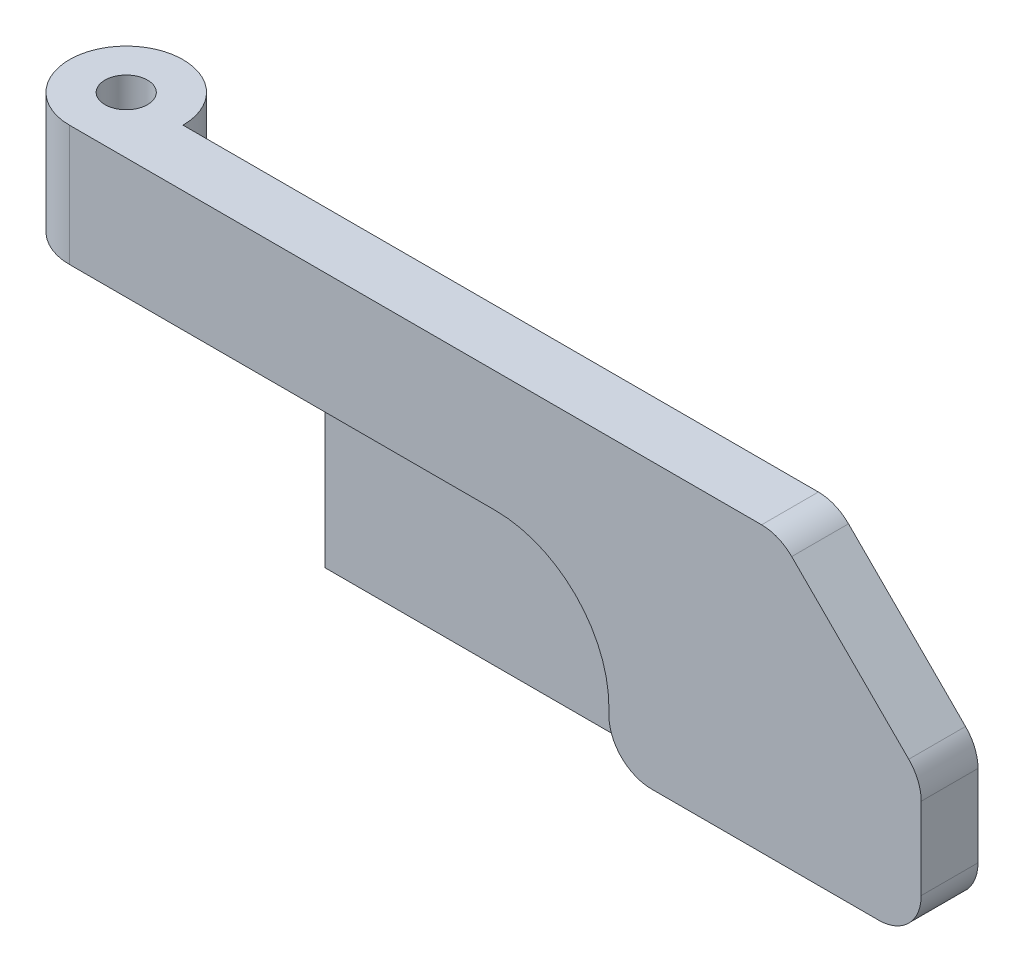
ISO-10303-21;
HEADER;
FILE_DESCRIPTION(('STEP AP214'),'2;1');
FILE_NAME('part.step','',(''),(''),'','','');
FILE_SCHEMA(('AUTOMOTIVE_DESIGN { 1 0 10303 214 1 1 1 1 }'));
ENDSEC;
DATA;
#1=APPLICATION_CONTEXT('core data for automotive mechanical design processes');
#2=APPLICATION_PROTOCOL_DEFINITION('international standard','automotive_design',2000,#1);
#3=PRODUCT_CONTEXT('',#1,'mechanical');
#4=PRODUCT('Part','Part','',(#3));
#5=PRODUCT_RELATED_PRODUCT_CATEGORY('part','',(#4));
#6=PRODUCT_DEFINITION_FORMATION('','',#4);
#7=PRODUCT_DEFINITION_CONTEXT('part definition',#1,'design');
#8=PRODUCT_DEFINITION('design','',#6,#7);
#9=PRODUCT_DEFINITION_SHAPE('','',#8);
#10=(LENGTH_UNIT() NAMED_UNIT(*) SI_UNIT(.MILLI.,.METRE.));
#11=(NAMED_UNIT(*) PLANE_ANGLE_UNIT() SI_UNIT($,.RADIAN.));
#12=(NAMED_UNIT(*) SI_UNIT($,.STERADIAN.) SOLID_ANGLE_UNIT());
#13=UNCERTAINTY_MEASURE_WITH_UNIT(LENGTH_MEASURE(1.E-05),#10,'distance_accuracy_value','');
#14=(GEOMETRIC_REPRESENTATION_CONTEXT(3) GLOBAL_UNCERTAINTY_ASSIGNED_CONTEXT((#13)) GLOBAL_UNIT_ASSIGNED_CONTEXT((#10,
#11,#12)) REPRESENTATION_CONTEXT('',''));
#15=CARTESIAN_POINT('',(0.,0.,0.));
#16=DIRECTION('',(0.,0.,1.));
#17=DIRECTION('',(1.,0.,0.));
#18=AXIS2_PLACEMENT_3D('',#15,#16,#17);
#19=CARTESIAN_POINT('',(0.,20.,0.));
#20=DIRECTION('',(0.,-1.,0.));
#21=DIRECTION('',(0.,0.,-1.));
#22=AXIS2_PLACEMENT_3D('',#19,#20,#21);
#23=CYLINDRICAL_SURFACE('',#22,4.);
#24=DIRECTION('',(0.,-1.,0.));
#25=VECTOR('',#24,1.);
#26=CARTESIAN_POINT('',(4.,20.,0.));
#27=LINE('',#26,#25);
#28=CARTESIAN_POINT('',(4.,20.,0.));
#29=VERTEX_POINT('',#28);
#30=CARTESIAN_POINT('',(4.,11.5,0.));
#31=VERTEX_POINT('',#30);
#32=EDGE_CURVE('E278',#29,#31,#27,.T.);
#33=ORIENTED_EDGE('',*,*,#32,.T.);
#34=CARTESIAN_POINT('',(0.,11.5,0.));
#35=DIRECTION('',(0.,1.,0.));
#36=DIRECTION('',(0.,0.,1.));
#37=AXIS2_PLACEMENT_3D('',#34,#35,#36);
#38=CIRCLE('',#37,4.);
#39=CARTESIAN_POINT('',(0.,11.5,4.));
#40=VERTEX_POINT('',#39);
#41=EDGE_CURVE('E300',#31,#40,#38,.T.);
#42=ORIENTED_EDGE('',*,*,#41,.T.);
#43=DIRECTION('',(0.,-1.,0.));
#44=VECTOR('',#43,1.);
#45=CARTESIAN_POINT('',(0.,20.,4.));
#46=LINE('',#45,#44);
#47=CARTESIAN_POINT('',(0.,20.,4.));
#48=VERTEX_POINT('',#47);
#49=EDGE_CURVE('E165',#48,#40,#46,.T.);
#50=ORIENTED_EDGE('',*,*,#49,.F.);
#51=CARTESIAN_POINT('',(0.,20.,0.));
#52=DIRECTION('',(0.,1.,0.));
#53=DIRECTION('',(0.,0.,1.));
#54=AXIS2_PLACEMENT_3D('',#51,#52,#53);
#55=CIRCLE('',#54,4.);
#56=EDGE_CURVE('E293',#29,#48,#55,.T.);
#57=ORIENTED_EDGE('',*,*,#56,.F.);
#58=EDGE_LOOP('',(#33,#42,#50,#57));
#59=FACE_BOUND('',#58,.T.);
#60=ADVANCED_FACE('F35',(#59),#23,.T.);
#61=CARTESIAN_POINT('',(0.,20.,4.));
#62=DIRECTION('',(0.,0.,-1.));
#63=DIRECTION('',(-1.,0.,0.));
#64=AXIS2_PLACEMENT_3D('',#61,#62,#63);
#65=PLANE('',#64);
#66=DIRECTION('',(0.,1.,0.));
#67=VECTOR('',#66,1.);
#68=CARTESIAN_POINT('',(38.,11.5,4.));
#69=LINE('',#68,#67);
#70=CARTESIAN_POINT('',(38.,3.,4.));
#71=VERTEX_POINT('',#70);
#72=CARTESIAN_POINT('',(38.,3.5,4.));
#73=VERTEX_POINT('',#72);
#74=EDGE_CURVE('E158',#71,#73,#69,.T.);
#75=ORIENTED_EDGE('',*,*,#74,.F.);
#76=CARTESIAN_POINT('',(41.,3.,4.));
#77=DIRECTION('',(0.,0.,-1.));
#78=DIRECTION('',(-1.,0.,0.));
#79=AXIS2_PLACEMENT_3D('',#76,#77,#78);
#80=CIRCLE('',#79,3.);
#81=CARTESIAN_POINT('',(41.,0.,4.));
#82=VERTEX_POINT('',#81);
#83=EDGE_CURVE('E211',#71,#82,#80,.F.);
#84=ORIENTED_EDGE('',*,*,#83,.T.);
#85=DIRECTION('',(1.,0.,0.));
#86=VECTOR('',#85,1.);
#87=CARTESIAN_POINT('',(0.,0.,4.));
#88=LINE('',#87,#86);
#89=CARTESIAN_POINT('',(57.,0.,4.));
#90=VERTEX_POINT('',#89);
#91=EDGE_CURVE('E286',#82,#90,#88,.T.);
#92=ORIENTED_EDGE('',*,*,#91,.T.);
#93=CARTESIAN_POINT('',(57.,3.,4.));
#94=DIRECTION('',(0.,0.,-1.));
#95=DIRECTION('',(-1.,0.,0.));
#96=AXIS2_PLACEMENT_3D('',#93,#94,#95);
#97=CIRCLE('',#96,3.);
#98=CARTESIAN_POINT('',(60.,3.,4.));
#99=VERTEX_POINT('',#98);
#100=EDGE_CURVE('E187',#90,#99,#97,.F.);
#101=ORIENTED_EDGE('',*,*,#100,.T.);
#102=DIRECTION('',(0.,-1.,0.));
#103=VECTOR('',#102,1.);
#104=CARTESIAN_POINT('',(60.,20.,4.));
#105=LINE('',#104,#103);
#106=CARTESIAN_POINT('',(60.,8.75735931288068,4.));
#107=VERTEX_POINT('',#106);
#108=EDGE_CURVE('E170',#107,#99,#105,.T.);
#109=ORIENTED_EDGE('',*,*,#108,.F.);
#110=CARTESIAN_POINT('',(57.,8.75735931288068,4.));
#111=DIRECTION('',(0.,0.,-1.));
#112=DIRECTION('',(-1.,0.,0.));
#113=AXIS2_PLACEMENT_3D('',#110,#111,#112);
#114=CIRCLE('',#113,3.);
#115=CARTESIAN_POINT('',(59.1213203435596,10.8786796564403,4.));
#116=VERTEX_POINT('',#115);
#117=EDGE_CURVE('E201',#107,#116,#114,.F.);
#118=ORIENTED_EDGE('',*,*,#117,.T.);
#119=DIRECTION('',(-0.707106781186546,0.707106781186549,0.));
#120=VECTOR('',#119,1.);
#121=CARTESIAN_POINT('',(50.,20.,4.));
#122=LINE('',#121,#120);
#123=CARTESIAN_POINT('',(50.8786796564404,19.1213203435596,4.));
#124=VERTEX_POINT('',#123);
#125=EDGE_CURVE('E176',#116,#124,#122,.T.);
#126=ORIENTED_EDGE('',*,*,#125,.T.);
#127=CARTESIAN_POINT('',(48.7573593128807,17.,4.));
#128=DIRECTION('',(0.,0.,-1.));
#129=DIRECTION('',(-1.,0.,0.));
#130=AXIS2_PLACEMENT_3D('',#127,#128,#129);
#131=CIRCLE('',#130,3.);
#132=CARTESIAN_POINT('',(48.7573593128807,20.,4.));
#133=VERTEX_POINT('',#132);
#134=EDGE_CURVE('E203',#124,#133,#131,.F.);
#135=ORIENTED_EDGE('',*,*,#134,.T.);
#136=DIRECTION('',(1.,0.,0.));
#137=VECTOR('',#136,1.);
#138=CARTESIAN_POINT('',(0.,20.,4.));
#139=LINE('',#138,#137);
#140=EDGE_CURVE('E290',#48,#133,#139,.T.);
#141=ORIENTED_EDGE('',*,*,#140,.F.);
#142=ORIENTED_EDGE('',*,*,#49,.T.);
#143=DIRECTION('',(-1.,0.,0.));
#144=VECTOR('',#143,1.);
#145=CARTESIAN_POINT('',(-11.8071770657587,11.5,4.));
#146=LINE('',#145,#144);
#147=CARTESIAN_POINT('',(30.,11.5,4.));
#148=VERTEX_POINT('',#147);
#149=EDGE_CURVE('E146',#148,#40,#146,.T.);
#150=ORIENTED_EDGE('',*,*,#149,.F.);
#151=CARTESIAN_POINT('',(30.,3.5,4.));
#152=DIRECTION('',(0.,0.,-1.));
#153=DIRECTION('',(-1.,0.,0.));
#154=AXIS2_PLACEMENT_3D('',#151,#152,#153);
#155=CIRCLE('',#154,8.);
#156=EDGE_CURVE('E11',#148,#73,#155,.T.);
#157=ORIENTED_EDGE('',*,*,#156,.T.);
#158=EDGE_LOOP('',(#75,#84,#92,#101,#109,#118,#126,#135,#141,#142,#150,#157));
#159=FACE_BOUND('',#158,.T.);
#160=ADVANCED_FACE('F234',(#159),#65,.F.);
#161=CARTESIAN_POINT('',(60.,20.,0.));
#162=DIRECTION('',(-1.,0.,0.));
#163=DIRECTION('',(0.,0.,1.));
#164=AXIS2_PLACEMENT_3D('',#161,#162,#163);
#165=PLANE('',#164);
#166=DIRECTION('',(0.,-1.,0.));
#167=VECTOR('',#166,1.);
#168=CARTESIAN_POINT('',(60.,20.,0.));
#169=LINE('',#168,#167);
#170=CARTESIAN_POINT('',(60.,8.75735931288068,0.));
#171=VERTEX_POINT('',#170);
#172=CARTESIAN_POINT('',(60.,3.,0.));
#173=VERTEX_POINT('',#172);
#174=EDGE_CURVE('E272',#171,#173,#169,.T.);
#175=ORIENTED_EDGE('',*,*,#174,.F.);
#176=DIRECTION('',(0.,0.,1.));
#177=VECTOR('',#176,1.);
#178=CARTESIAN_POINT('',(60.,8.75735931288068,4.));
#179=LINE('',#178,#177);
#180=EDGE_CURVE('E205',#171,#107,#179,.T.);
#181=ORIENTED_EDGE('',*,*,#180,.T.);
#182=ORIENTED_EDGE('',*,*,#108,.T.);
#183=DIRECTION('',(0.,0.,-1.));
#184=VECTOR('',#183,1.);
#185=CARTESIAN_POINT('',(60.,3.,0.));
#186=LINE('',#185,#184);
#187=EDGE_CURVE('E179',#99,#173,#186,.T.);
#188=ORIENTED_EDGE('',*,*,#187,.T.);
#189=EDGE_LOOP('',(#175,#181,#182,#188));
#190=FACE_BOUND('',#189,.T.);
#191=ADVANCED_FACE('F240',(#190),#165,.F.);
#192=CARTESIAN_POINT('',(0.,20.,0.));
#193=DIRECTION('',(0.,-1.,0.));
#194=DIRECTION('',(0.,0.,-1.));
#195=AXIS2_PLACEMENT_3D('',#192,#193,#194);
#196=CYLINDRICAL_SURFACE('',#195,1.5);
#197=CARTESIAN_POINT('',(0.,11.5,0.));
#198=DIRECTION('',(0.,1.,0.));
#199=DIRECTION('',(0.,0.,1.));
#200=AXIS2_PLACEMENT_3D('',#197,#198,#199);
#201=CIRCLE('',#200,1.5);
#202=CARTESIAN_POINT('',(0.,11.5,1.5));
#203=VERTEX_POINT('',#202);
#204=EDGE_CURVE('E288',#203,#203,#201,.T.);
#205=ORIENTED_EDGE('',*,*,#204,.F.);
#206=EDGE_LOOP('',(#205));
#207=FACE_BOUND('',#206,.T.);
#208=CARTESIAN_POINT('',(0.,20.,0.));
#209=DIRECTION('',(0.,1.,0.));
#210=DIRECTION('',(0.,0.,1.));
#211=AXIS2_PLACEMENT_3D('',#208,#209,#210);
#212=CIRCLE('',#211,1.5);
#213=CARTESIAN_POINT('',(0.,20.,1.5));
#214=VERTEX_POINT('',#213);
#215=EDGE_CURVE('E285',#214,#214,#212,.T.);
#216=ORIENTED_EDGE('',*,*,#215,.T.);
#217=EDGE_LOOP('',(#216));
#218=FACE_BOUND('',#217,.T.);
#219=ADVANCED_FACE('F245',(#207,#218),#196,.F.);
#220=CARTESIAN_POINT('',(0.,20.,0.));
#221=DIRECTION('',(0.,0.,-1.));
#222=DIRECTION('',(-1.,0.,0.));
#223=AXIS2_PLACEMENT_3D('',#220,#221,#222);
#224=PLANE('',#223);
#225=DIRECTION('',(1.,0.,0.));
#226=VECTOR('',#225,1.);
#227=CARTESIAN_POINT('',(0.,20.,0.));
#228=LINE('',#227,#226);
#229=CARTESIAN_POINT('',(48.7573593128807,20.,0.));
#230=VERTEX_POINT('',#229);
#231=EDGE_CURVE('E280',#29,#230,#228,.T.);
#232=ORIENTED_EDGE('',*,*,#231,.T.);
#233=CARTESIAN_POINT('',(48.7573593128807,17.,0.));
#234=DIRECTION('',(0.,0.,-1.));
#235=DIRECTION('',(-1.,0.,0.));
#236=AXIS2_PLACEMENT_3D('',#233,#234,#235);
#237=CIRCLE('',#236,3.);
#238=CARTESIAN_POINT('',(50.8786796564404,19.1213203435596,0.));
#239=VERTEX_POINT('',#238);
#240=EDGE_CURVE('E195',#230,#239,#237,.T.);
#241=ORIENTED_EDGE('',*,*,#240,.T.);
#242=DIRECTION('',(0.707106781186546,-0.707106781186549,0.));
#243=VECTOR('',#242,1.);
#244=CARTESIAN_POINT('',(25.0000000000001,45.,0.));
#245=LINE('',#244,#243);
#246=CARTESIAN_POINT('',(59.1213203435596,10.8786796564403,0.));
#247=VERTEX_POINT('',#246);
#248=EDGE_CURVE('E167',#239,#247,#245,.T.);
#249=ORIENTED_EDGE('',*,*,#248,.T.);
#250=CARTESIAN_POINT('',(57.,8.75735931288068,0.));
#251=DIRECTION('',(0.,0.,-1.));
#252=DIRECTION('',(-1.,0.,0.));
#253=AXIS2_PLACEMENT_3D('',#250,#251,#252);
#254=CIRCLE('',#253,3.);
#255=EDGE_CURVE('E193',#247,#171,#254,.T.);
#256=ORIENTED_EDGE('',*,*,#255,.T.);
#257=ORIENTED_EDGE('',*,*,#174,.T.);
#258=CARTESIAN_POINT('',(57.,3.,0.));
#259=DIRECTION('',(0.,0.,-1.));
#260=DIRECTION('',(-1.,0.,0.));
#261=AXIS2_PLACEMENT_3D('',#258,#259,#260);
#262=CIRCLE('',#261,3.);
#263=CARTESIAN_POINT('',(57.,0.,0.));
#264=VERTEX_POINT('',#263);
#265=EDGE_CURVE('E182',#173,#264,#262,.T.);
#266=ORIENTED_EDGE('',*,*,#265,.T.);
#267=DIRECTION('',(1.,0.,0.));
#268=VECTOR('',#267,1.);
#269=CARTESIAN_POINT('',(0.,0.,0.));
#270=LINE('',#269,#268);
#271=CARTESIAN_POINT('',(16.,0.,0.));
#272=VERTEX_POINT('',#271);
#273=EDGE_CURVE('E283',#272,#264,#270,.T.);
#274=ORIENTED_EDGE('',*,*,#273,.F.);
#275=DIRECTION('',(0.,-1.,0.));
#276=VECTOR('',#275,1.);
#277=CARTESIAN_POINT('',(16.,20.,0.));
#278=LINE('',#277,#276);
#279=CARTESIAN_POINT('',(16.,11.5,0.));
#280=VERTEX_POINT('',#279);
#281=EDGE_CURVE('E162',#280,#272,#278,.T.);
#282=ORIENTED_EDGE('',*,*,#281,.F.);
#283=DIRECTION('',(1.,0.,0.));
#284=VECTOR('',#283,1.);
#285=CARTESIAN_POINT('',(0.,11.5,0.));
#286=LINE('',#285,#284);
#287=EDGE_CURVE('E164',#31,#280,#286,.T.);
#288=ORIENTED_EDGE('',*,*,#287,.F.);
#289=ORIENTED_EDGE('',*,*,#32,.F.);
#290=EDGE_LOOP('',(#232,#241,#249,#256,#257,#266,#274,#282,#288,#289));
#291=FACE_BOUND('',#290,.T.);
#292=ADVANCED_FACE('F248',(#291),#224,.T.);
#293=CARTESIAN_POINT('',(0.,20.,0.));
#294=DIRECTION('',(0.,1.,0.));
#295=DIRECTION('',(0.,0.,1.));
#296=AXIS2_PLACEMENT_3D('',#293,#294,#295);
#297=PLANE('',#296);
#298=ORIENTED_EDGE('',*,*,#215,.F.);
#299=EDGE_LOOP('',(#298));
#300=FACE_BOUND('',#299,.T.);
#301=ORIENTED_EDGE('',*,*,#140,.T.);
#302=DIRECTION('',(0.,0.,-1.));
#303=VECTOR('',#302,1.);
#304=CARTESIAN_POINT('',(48.7573593128807,20.,0.));
#305=LINE('',#304,#303);
#306=EDGE_CURVE('E190',#133,#230,#305,.T.);
#307=ORIENTED_EDGE('',*,*,#306,.T.);
#308=ORIENTED_EDGE('',*,*,#231,.F.);
#309=ORIENTED_EDGE('',*,*,#56,.T.);
#310=EDGE_LOOP('',(#301,#307,#308,#309));
#311=FACE_BOUND('',#310,.T.);
#312=ADVANCED_FACE('F316',(#300,#311),#297,.T.);
#313=CARTESIAN_POINT('',(0.,0.,0.));
#314=DIRECTION('',(0.,1.,0.));
#315=DIRECTION('',(0.,0.,1.));
#316=AXIS2_PLACEMENT_3D('',#313,#314,#315);
#317=PLANE('',#316);
#318=ORIENTED_EDGE('',*,*,#91,.F.);
#319=DIRECTION('',(0.,0.,1.));
#320=VECTOR('',#319,1.);
#321=CARTESIAN_POINT('',(41.,0.,0.));
#322=LINE('',#321,#320);
#323=CARTESIAN_POINT('',(41.,0.,2.));
#324=VERTEX_POINT('',#323);
#325=EDGE_CURVE('E155',#82,#324,#322,.F.);
#326=ORIENTED_EDGE('',*,*,#325,.T.);
#327=DIRECTION('',(1.,0.,0.));
#328=VECTOR('',#327,1.);
#329=CARTESIAN_POINT('',(38.,0.,2.));
#330=LINE('',#329,#328);
#331=CARTESIAN_POINT('',(16.,0.,2.));
#332=VERTEX_POINT('',#331);
#333=EDGE_CURVE('E138',#332,#324,#330,.T.);
#334=ORIENTED_EDGE('',*,*,#333,.F.);
#335=DIRECTION('',(0.,0.,-1.));
#336=VECTOR('',#335,1.);
#337=CARTESIAN_POINT('',(16.,0.,0.));
#338=LINE('',#337,#336);
#339=EDGE_CURVE('E152',#332,#272,#338,.T.);
#340=ORIENTED_EDGE('',*,*,#339,.T.);
#341=ORIENTED_EDGE('',*,*,#273,.T.);
#342=DIRECTION('',(0.,0.,-1.));
#343=VECTOR('',#342,1.);
#344=CARTESIAN_POINT('',(57.,0.,0.));
#345=LINE('',#344,#343);
#346=EDGE_CURVE('E184',#264,#90,#345,.F.);
#347=ORIENTED_EDGE('',*,*,#346,.T.);
#348=EDGE_LOOP('',(#318,#326,#334,#340,#341,#347));
#349=FACE_BOUND('',#348,.T.);
#350=ADVANCED_FACE('F150',(#349),#317,.F.);
#351=CARTESIAN_POINT('',(-11.8071770657587,11.5,-16.));
#352=DIRECTION('',(0.,1.,0.));
#353=DIRECTION('',(0.,0.,1.));
#354=AXIS2_PLACEMENT_3D('',#351,#352,#353);
#355=PLANE('',#354);
#356=ORIENTED_EDGE('',*,*,#204,.T.);
#357=EDGE_LOOP('',(#356));
#358=FACE_BOUND('',#357,.T.);
#359=DIRECTION('',(-1.,0.,0.));
#360=VECTOR('',#359,1.);
#361=CARTESIAN_POINT('',(16.,11.5,2.));
#362=LINE('',#361,#360);
#363=CARTESIAN_POINT('',(30.,11.5,2.));
#364=VERTEX_POINT('',#363);
#365=CARTESIAN_POINT('',(16.,11.5,2.));
#366=VERTEX_POINT('',#365);
#367=EDGE_CURVE('E141',#364,#366,#362,.T.);
#368=ORIENTED_EDGE('',*,*,#367,.F.);
#369=DIRECTION('',(0.,0.,1.));
#370=VECTOR('',#369,1.);
#371=CARTESIAN_POINT('',(30.,11.5,4.));
#372=LINE('',#371,#370);
#373=EDGE_CURVE('E216',#364,#148,#372,.T.);
#374=ORIENTED_EDGE('',*,*,#373,.T.);
#375=ORIENTED_EDGE('',*,*,#149,.T.);
#376=ORIENTED_EDGE('',*,*,#41,.F.);
#377=ORIENTED_EDGE('',*,*,#287,.T.);
#378=DIRECTION('',(0.,0.,1.));
#379=VECTOR('',#378,1.);
#380=CARTESIAN_POINT('',(16.,11.5,-16.));
#381=LINE('',#380,#379);
#382=EDGE_CURVE('E224',#280,#366,#381,.T.);
#383=ORIENTED_EDGE('',*,*,#382,.T.);
#384=EDGE_LOOP('',(#368,#374,#375,#376,#377,#383));
#385=FACE_BOUND('',#384,.T.);
#386=ADVANCED_FACE('F223',(#358,#385),#355,.F.);
#387=CARTESIAN_POINT('',(16.,11.5,-16.));
#388=DIRECTION('',(1.,0.,0.));
#389=DIRECTION('',(0.,0.,-1.));
#390=AXIS2_PLACEMENT_3D('',#387,#388,#389);
#391=PLANE('',#390);
#392=ORIENTED_EDGE('',*,*,#339,.F.);
#393=DIRECTION('',(0.,-1.,0.));
#394=VECTOR('',#393,1.);
#395=CARTESIAN_POINT('',(16.,0.,2.));
#396=LINE('',#395,#394);
#397=EDGE_CURVE('E135',#366,#332,#396,.T.);
#398=ORIENTED_EDGE('',*,*,#397,.F.);
#399=ORIENTED_EDGE('',*,*,#382,.F.);
#400=ORIENTED_EDGE('',*,*,#281,.T.);
#401=EDGE_LOOP('',(#392,#398,#399,#400));
#402=FACE_BOUND('',#401,.T.);
#403=ADVANCED_FACE('F160',(#402),#391,.F.);
#404=CARTESIAN_POINT('',(38.,11.5,2.));
#405=DIRECTION('',(1.,0.,0.));
#406=DIRECTION('',(0.,0.,-1.));
#407=AXIS2_PLACEMENT_3D('',#404,#405,#406);
#408=PLANE('',#407);
#409=ORIENTED_EDGE('',*,*,#74,.T.);
#410=DIRECTION('',(0.,0.,1.));
#411=VECTOR('',#410,1.);
#412=CARTESIAN_POINT('',(38.,3.5,2.));
#413=LINE('',#412,#411);
#414=CARTESIAN_POINT('',(38.,3.5,2.));
#415=VERTEX_POINT('',#414);
#416=EDGE_CURVE('E55',#73,#415,#413,.F.);
#417=ORIENTED_EDGE('',*,*,#416,.T.);
#418=DIRECTION('',(0.,1.,0.));
#419=VECTOR('',#418,1.);
#420=CARTESIAN_POINT('',(38.,11.5,2.));
#421=LINE('',#420,#419);
#422=CARTESIAN_POINT('',(38.,3.,2.));
#423=VERTEX_POINT('',#422);
#424=EDGE_CURVE('E157',#423,#415,#421,.T.);
#425=ORIENTED_EDGE('',*,*,#424,.F.);
#426=DIRECTION('',(0.,0.,1.));
#427=VECTOR('',#426,1.);
#428=CARTESIAN_POINT('',(38.,3.,2.));
#429=LINE('',#428,#427);
#430=EDGE_CURVE('E208',#423,#71,#429,.T.);
#431=ORIENTED_EDGE('',*,*,#430,.T.);
#432=EDGE_LOOP('',(#409,#417,#425,#431));
#433=FACE_BOUND('',#432,.T.);
#434=ADVANCED_FACE('F307',(#433),#408,.F.);
#435=CARTESIAN_POINT('',(0.,0.,2.));
#436=DIRECTION('',(0.,0.,-1.));
#437=DIRECTION('',(-1.,0.,0.));
#438=AXIS2_PLACEMENT_3D('',#435,#436,#437);
#439=PLANE('',#438);
#440=ORIENTED_EDGE('',*,*,#424,.T.);
#441=CARTESIAN_POINT('',(30.,3.5,2.));
#442=DIRECTION('',(0.,0.,-1.));
#443=DIRECTION('',(-1.,0.,0.));
#444=AXIS2_PLACEMENT_3D('',#441,#442,#443);
#445=CIRCLE('',#444,8.);
#446=EDGE_CURVE('E43',#415,#364,#445,.F.);
#447=ORIENTED_EDGE('',*,*,#446,.T.);
#448=ORIENTED_EDGE('',*,*,#367,.T.);
#449=ORIENTED_EDGE('',*,*,#397,.T.);
#450=ORIENTED_EDGE('',*,*,#333,.T.);
#451=CARTESIAN_POINT('',(41.,3.,2.));
#452=DIRECTION('',(0.,0.,-1.));
#453=DIRECTION('',(-1.,0.,0.));
#454=AXIS2_PLACEMENT_3D('',#451,#452,#453);
#455=CIRCLE('',#454,3.);
#456=EDGE_CURVE('E214',#324,#423,#455,.T.);
#457=ORIENTED_EDGE('',*,*,#456,.T.);
#458=EDGE_LOOP('',(#440,#447,#448,#449,#450,#457));
#459=FACE_BOUND('',#458,.T.);
#460=ADVANCED_FACE('F137',(#459),#439,.F.);
#461=CARTESIAN_POINT('',(50.,20.,0.));
#462=DIRECTION('',(0.707106781186549,0.707106781186546,0.));
#463=DIRECTION('',(0.,0.,1.));
#464=AXIS2_PLACEMENT_3D('',#461,#462,#463);
#465=PLANE('',#464);
#466=ORIENTED_EDGE('',*,*,#248,.F.);
#467=DIRECTION('',(0.,0.,-1.));
#468=VECTOR('',#467,1.);
#469=CARTESIAN_POINT('',(50.8786796564404,19.1213203435596,0.));
#470=LINE('',#469,#468);
#471=EDGE_CURVE('E199',#239,#124,#470,.F.);
#472=ORIENTED_EDGE('',*,*,#471,.T.);
#473=ORIENTED_EDGE('',*,*,#125,.F.);
#474=DIRECTION('',(0.,0.,1.));
#475=VECTOR('',#474,1.);
#476=CARTESIAN_POINT('',(59.1213203435596,10.8786796564403,0.));
#477=LINE('',#476,#475);
#478=EDGE_CURVE('E197',#116,#247,#477,.F.);
#479=ORIENTED_EDGE('',*,*,#478,.T.);
#480=EDGE_LOOP('',(#466,#472,#473,#479));
#481=FACE_BOUND('',#480,.T.);
#482=ADVANCED_FACE('F250',(#481),#465,.T.);
#483=CARTESIAN_POINT('',(57.,3.,0.));
#484=DIRECTION('',(0.,0.,-1.));
#485=DIRECTION('',(-1.,0.,0.));
#486=AXIS2_PLACEMENT_3D('',#483,#484,#485);
#487=CYLINDRICAL_SURFACE('',#486,3.);
#488=ORIENTED_EDGE('',*,*,#100,.F.);
#489=ORIENTED_EDGE('',*,*,#346,.F.);
#490=ORIENTED_EDGE('',*,*,#265,.F.);
#491=ORIENTED_EDGE('',*,*,#187,.F.);
#492=EDGE_LOOP('',(#488,#489,#490,#491));
#493=FACE_BOUND('',#492,.T.);
#494=ADVANCED_FACE('F253',(#493),#487,.T.);
#495=CARTESIAN_POINT('',(48.7573593128807,17.,0.));
#496=DIRECTION('',(0.,0.,-1.));
#497=DIRECTION('',(-1.,0.,0.));
#498=AXIS2_PLACEMENT_3D('',#495,#496,#497);
#499=CYLINDRICAL_SURFACE('',#498,3.);
#500=ORIENTED_EDGE('',*,*,#134,.F.);
#501=ORIENTED_EDGE('',*,*,#471,.F.);
#502=ORIENTED_EDGE('',*,*,#240,.F.);
#503=ORIENTED_EDGE('',*,*,#306,.F.);
#504=EDGE_LOOP('',(#500,#501,#502,#503));
#505=FACE_BOUND('',#504,.T.);
#506=ADVANCED_FACE('F257',(#505),#499,.T.);
#507=CARTESIAN_POINT('',(57.,8.75735931288068,0.));
#508=DIRECTION('',(0.,0.,-1.));
#509=DIRECTION('',(-1.,0.,0.));
#510=AXIS2_PLACEMENT_3D('',#507,#508,#509);
#511=CYLINDRICAL_SURFACE('',#510,3.);
#512=ORIENTED_EDGE('',*,*,#255,.F.);
#513=ORIENTED_EDGE('',*,*,#478,.F.);
#514=ORIENTED_EDGE('',*,*,#117,.F.);
#515=ORIENTED_EDGE('',*,*,#180,.F.);
#516=EDGE_LOOP('',(#512,#513,#514,#515));
#517=FACE_BOUND('',#516,.T.);
#518=ADVANCED_FACE('F231',(#517),#511,.T.);
#519=CARTESIAN_POINT('',(41.,3.,2.));
#520=DIRECTION('',(0.,0.,1.));
#521=DIRECTION('',(1.,0.,0.));
#522=AXIS2_PLACEMENT_3D('',#519,#520,#521);
#523=CYLINDRICAL_SURFACE('',#522,3.);
#524=ORIENTED_EDGE('',*,*,#456,.F.);
#525=ORIENTED_EDGE('',*,*,#325,.F.);
#526=ORIENTED_EDGE('',*,*,#83,.F.);
#527=ORIENTED_EDGE('',*,*,#430,.F.);
#528=EDGE_LOOP('',(#524,#525,#526,#527));
#529=FACE_BOUND('',#528,.T.);
#530=ADVANCED_FACE('F227',(#529),#523,.T.);
#531=CARTESIAN_POINT('',(30.,3.5,-16.));
#532=DIRECTION('',(0.,0.,-1.));
#533=DIRECTION('',(-1.,0.,0.));
#534=AXIS2_PLACEMENT_3D('',#531,#532,#533);
#535=CYLINDRICAL_SURFACE('',#534,8.);
#536=ORIENTED_EDGE('',*,*,#446,.F.);
#537=ORIENTED_EDGE('',*,*,#416,.F.);
#538=ORIENTED_EDGE('',*,*,#156,.F.);
#539=ORIENTED_EDGE('',*,*,#373,.F.);
#540=EDGE_LOOP('',(#536,#537,#538,#539));
#541=FACE_BOUND('',#540,.T.);
#542=ADVANCED_FACE('F37',(#541),#535,.F.);
#543=CLOSED_SHELL('',(#60,#160,#191,#219,#292,#312,#350,#386,#403,#434,#460,#482,#494,#506,#518,
#530,#542));
#544=MANIFOLD_SOLID_BREP('B2',#543);
#545=ADVANCED_BREP_SHAPE_REPRESENTATION('',(#18,#544),#14);
#546=SHAPE_DEFINITION_REPRESENTATION(#9,#545);
ENDSEC;
END-ISO-10303-21;
